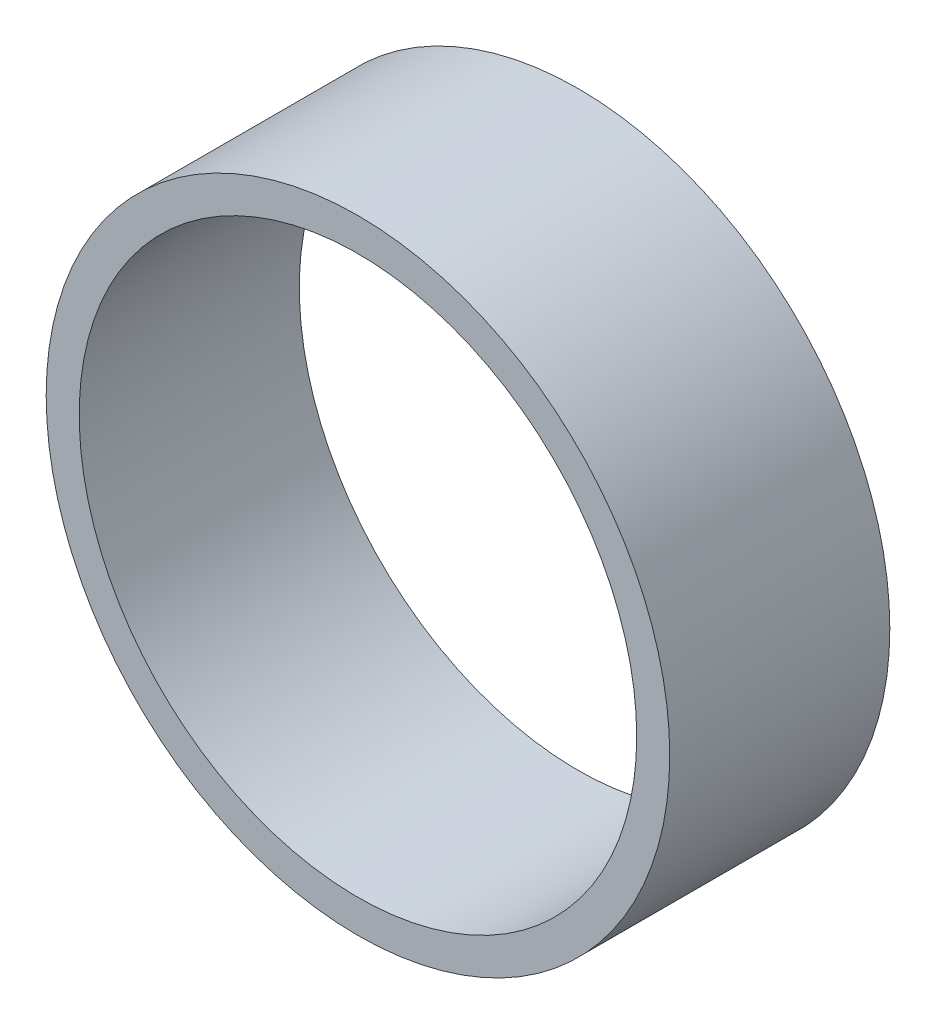
ISO-10303-21;
HEADER;
FILE_DESCRIPTION(('STEP AP214'),'2;1');
FILE_NAME('part.step','',(''),(''),'','','');
FILE_SCHEMA(('AUTOMOTIVE_DESIGN { 1 0 10303 214 1 1 1 1 }'));
ENDSEC;
DATA;
#1=APPLICATION_CONTEXT('core data for automotive mechanical design processes');
#2=APPLICATION_PROTOCOL_DEFINITION('international standard','automotive_design',2000,#1);
#3=PRODUCT_CONTEXT('',#1,'mechanical');
#4=PRODUCT('Part','Part','',(#3));
#5=PRODUCT_RELATED_PRODUCT_CATEGORY('part','',(#4));
#6=PRODUCT_DEFINITION_FORMATION('','',#4);
#7=PRODUCT_DEFINITION_CONTEXT('part definition',#1,'design');
#8=PRODUCT_DEFINITION('design','',#6,#7);
#9=PRODUCT_DEFINITION_SHAPE('','',#8);
#10=(LENGTH_UNIT() NAMED_UNIT(*) SI_UNIT(.MILLI.,.METRE.));
#11=(NAMED_UNIT(*) PLANE_ANGLE_UNIT() SI_UNIT($,.RADIAN.));
#12=(NAMED_UNIT(*) SI_UNIT($,.STERADIAN.) SOLID_ANGLE_UNIT());
#13=UNCERTAINTY_MEASURE_WITH_UNIT(LENGTH_MEASURE(1.E-05),#10,'distance_accuracy_value','');
#14=(GEOMETRIC_REPRESENTATION_CONTEXT(3) GLOBAL_UNCERTAINTY_ASSIGNED_CONTEXT((#13)) GLOBAL_UNIT_ASSIGNED_CONTEXT((#10,
#11,#12)) REPRESENTATION_CONTEXT('',''));
#15=CARTESIAN_POINT('',(0.,0.,0.));
#16=DIRECTION('',(0.,0.,1.));
#17=DIRECTION('',(1.,0.,0.));
#18=AXIS2_PLACEMENT_3D('',#15,#16,#17);
#19=CARTESIAN_POINT('',(0.,0.,38.1));
#20=DIRECTION('',(0.,0.,-1.));
#21=DIRECTION('',(-1.,0.,0.));
#22=AXIS2_PLACEMENT_3D('',#19,#20,#21);
#23=CYLINDRICAL_SURFACE('',#22,53.975);
#24=CARTESIAN_POINT('',(0.,0.,38.1));
#25=DIRECTION('',(0.,0.,1.));
#26=DIRECTION('',(1.,0.,0.));
#27=AXIS2_PLACEMENT_3D('',#24,#25,#26);
#28=CIRCLE('',#27,53.975);
#29=CARTESIAN_POINT('',(-53.975,0.,38.1));
#30=VERTEX_POINT('',#29);
#31=EDGE_CURVE('E10',#30,#30,#28,.T.);
#32=CARTESIAN_POINT('',(0.,0.,0.));
#33=DIRECTION('',(0.,0.,1.));
#34=DIRECTION('',(1.,0.,0.));
#35=AXIS2_PLACEMENT_3D('',#32,#33,#34);
#36=CIRCLE('',#35,53.975);
#37=CARTESIAN_POINT('',(-53.975,0.,0.));
#38=VERTEX_POINT('',#37);
#39=EDGE_CURVE('E44',#38,#38,#36,.T.);
#40=CARTESIAN_POINT('',(-53.975,0.,38.1));
#41=CARTESIAN_POINT('',(-53.975,0.,37.703125));
#42=CARTESIAN_POINT('',(-53.975,0.,37.30625));
#43=CARTESIAN_POINT('',(-53.975,0.,36.5125));
#44=CARTESIAN_POINT('',(-53.975,0.,36.115625));
#45=CARTESIAN_POINT('',(-53.975,0.,35.321875));
#46=CARTESIAN_POINT('',(-53.975,0.,34.925));
#47=CARTESIAN_POINT('',(-53.975,0.,34.13125));
#48=CARTESIAN_POINT('',(-53.975,0.,33.734375));
#49=CARTESIAN_POINT('',(-53.975,0.,32.940625));
#50=CARTESIAN_POINT('',(-53.975,0.,32.54375));
#51=CARTESIAN_POINT('',(-53.975,0.,31.75));
#52=CARTESIAN_POINT('',(-53.975,0.,31.353125));
#53=CARTESIAN_POINT('',(-53.975,0.,30.559375));
#54=CARTESIAN_POINT('',(-53.975,0.,30.1625));
#55=CARTESIAN_POINT('',(-53.975,0.,29.36875));
#56=CARTESIAN_POINT('',(-53.975,0.,28.971875));
#57=CARTESIAN_POINT('',(-53.975,0.,28.178125));
#58=CARTESIAN_POINT('',(-53.975,0.,27.78125));
#59=CARTESIAN_POINT('',(-53.975,0.,26.9875));
#60=CARTESIAN_POINT('',(-53.975,0.,26.590625));
#61=CARTESIAN_POINT('',(-53.975,0.,25.796875));
#62=CARTESIAN_POINT('',(-53.975,0.,25.4));
#63=CARTESIAN_POINT('',(-53.975,0.,24.60625));
#64=CARTESIAN_POINT('',(-53.975,0.,24.209375));
#65=CARTESIAN_POINT('',(-53.975,0.,23.415625));
#66=CARTESIAN_POINT('',(-53.975,0.,23.01875));
#67=CARTESIAN_POINT('',(-53.975,0.,22.225));
#68=CARTESIAN_POINT('',(-53.975,0.,21.828125));
#69=CARTESIAN_POINT('',(-53.975,0.,21.034375));
#70=CARTESIAN_POINT('',(-53.975,0.,20.6375));
#71=CARTESIAN_POINT('',(-53.975,0.,19.84375));
#72=CARTESIAN_POINT('',(-53.975,0.,19.446875));
#73=CARTESIAN_POINT('',(-53.975,0.,18.653125));
#74=CARTESIAN_POINT('',(-53.975,0.,18.25625));
#75=CARTESIAN_POINT('',(-53.975,0.,17.4625));
#76=CARTESIAN_POINT('',(-53.975,0.,17.065625));
#77=CARTESIAN_POINT('',(-53.975,0.,16.271875));
#78=CARTESIAN_POINT('',(-53.975,0.,15.875));
#79=CARTESIAN_POINT('',(-53.975,0.,15.08125));
#80=CARTESIAN_POINT('',(-53.975,0.,14.684375));
#81=CARTESIAN_POINT('',(-53.975,0.,13.890625));
#82=CARTESIAN_POINT('',(-53.975,0.,13.49375));
#83=CARTESIAN_POINT('',(-53.975,0.,12.7));
#84=CARTESIAN_POINT('',(-53.975,0.,12.303125));
#85=CARTESIAN_POINT('',(-53.975,0.,11.509375));
#86=CARTESIAN_POINT('',(-53.975,0.,11.1125));
#87=CARTESIAN_POINT('',(-53.975,0.,10.31875));
#88=CARTESIAN_POINT('',(-53.975,0.,9.92187499999999));
#89=CARTESIAN_POINT('',(-53.975,0.,9.128125));
#90=CARTESIAN_POINT('',(-53.975,0.,8.73124999999999));
#91=CARTESIAN_POINT('',(-53.975,0.,7.93749999999999));
#92=CARTESIAN_POINT('',(-53.975,0.,7.54062499999999));
#93=CARTESIAN_POINT('',(-53.975,0.,6.746875));
#94=CARTESIAN_POINT('',(-53.975,0.,6.35));
#95=CARTESIAN_POINT('',(-53.975,0.,5.55625));
#96=CARTESIAN_POINT('',(-53.975,0.,5.159375));
#97=CARTESIAN_POINT('',(-53.975,0.,4.365625));
#98=CARTESIAN_POINT('',(-53.975,0.,3.96875));
#99=CARTESIAN_POINT('',(-53.975,0.,3.175));
#100=CARTESIAN_POINT('',(-53.975,0.,2.778125));
#101=CARTESIAN_POINT('',(-53.975,0.,1.984375));
#102=CARTESIAN_POINT('',(-53.975,0.,1.5875));
#103=CARTESIAN_POINT('',(-53.975,0.,0.79375));
#104=CARTESIAN_POINT('',(-53.975,0.,0.396875));
#105=CARTESIAN_POINT('',(-53.975,0.,0.));
#106=B_SPLINE_CURVE_WITH_KNOTS('',3,(#40,#41,#42,#43,#44,#45,#46,#47,#48,#49,#50,#51,#52,#53,
#54,#55,#56,#57,#58,#59,#60,#61,#62,#63,#64,#65,#66,#67,#68,#69,#70,#71,#72,#73,#74,#75,#76,#77,
#78,#79,#80,#81,#82,#83,#84,#85,#86,#87,#88,#89,#90,#91,#92,#93,#94,#95,#96,#97,#98,#99,#100,
#101,#102,#103,#104,#105),.UNSPECIFIED.,.F.,.F.,(4,2,2,2,2,2,2,2,2,2,2,2,2,2,2,2,2,2,2,2,2,2,2,
2,2,2,2,2,2,2,2,2,4),(0.,1.190625,2.38125,3.571875,4.7625,5.953125,7.14375,8.334375,
9.52500000000001,10.715625,11.90625,13.096875,14.2875,15.478125,16.66875,17.859375,19.05,
20.240625,21.43125,22.621875,23.8125,25.003125,26.19375,27.384375,28.575,29.765625,30.95625,
32.146875,33.3375,34.528125,35.71875,36.909375,38.1),.UNSPECIFIED.);
#107=EDGE_CURVE('BSEAM41',#30,#38,#106,.T.);
#108=ORIENTED_EDGE('',*,*,#31,.F.);
#109=ORIENTED_EDGE('',*,*,#39,.T.);
#110=ORIENTED_EDGE('',*,*,#107,.T.);
#111=ORIENTED_EDGE('',*,*,#107,.F.);
#112=EDGE_LOOP('',(#108,#110,#109,#111));
#113=FACE_BOUND('',#112,.T.);
#114=ADVANCED_FACE('F41',(#113),#23,.T.);
#115=CARTESIAN_POINT('',(0.,0.,38.1));
#116=DIRECTION('',(0.,0.,1.));
#117=DIRECTION('',(1.,0.,0.));
#118=AXIS2_PLACEMENT_3D('',#115,#116,#117);
#119=PLANE('',#118);
#120=CARTESIAN_POINT('',(0.,0.,38.1));
#121=DIRECTION('',(0.,0.,1.));
#122=DIRECTION('',(1.,0.,0.));
#123=AXIS2_PLACEMENT_3D('',#120,#121,#122);
#124=CIRCLE('',#123,48.26);
#125=CARTESIAN_POINT('',(48.26,0.,38.1));
#126=VERTEX_POINT('',#125);
#127=EDGE_CURVE('E55',#126,#126,#124,.T.);
#128=ORIENTED_EDGE('',*,*,#127,.F.);
#129=EDGE_LOOP('',(#128));
#130=FACE_BOUND('',#129,.T.);
#131=ORIENTED_EDGE('',*,*,#31,.T.);
#132=EDGE_LOOP('',(#131));
#133=FACE_BOUND('',#132,.T.);
#134=ADVANCED_FACE('F72',(#130,#133),#119,.T.);
#135=CARTESIAN_POINT('',(0.,0.,0.));
#136=DIRECTION('',(0.,0.,1.));
#137=DIRECTION('',(1.,0.,0.));
#138=AXIS2_PLACEMENT_3D('',#135,#136,#137);
#139=PLANE('',#138);
#140=CARTESIAN_POINT('',(0.,0.,0.));
#141=DIRECTION('',(0.,0.,1.));
#142=DIRECTION('',(1.,0.,0.));
#143=AXIS2_PLACEMENT_3D('',#140,#141,#142);
#144=CIRCLE('',#143,48.26);
#145=CARTESIAN_POINT('',(48.26,0.,0.));
#146=VERTEX_POINT('',#145);
#147=EDGE_CURVE('E53',#146,#146,#144,.T.);
#148=ORIENTED_EDGE('',*,*,#147,.T.);
#149=EDGE_LOOP('',(#148));
#150=FACE_BOUND('',#149,.T.);
#151=ORIENTED_EDGE('',*,*,#39,.F.);
#152=EDGE_LOOP('',(#151));
#153=FACE_BOUND('',#152,.T.);
#154=ADVANCED_FACE('F63',(#150,#153),#139,.F.);
#155=CARTESIAN_POINT('',(0.,0.,0.));
#156=DIRECTION('',(0.,0.,1.));
#157=DIRECTION('',(1.,0.,0.));
#158=AXIS2_PLACEMENT_3D('',#155,#156,#157);
#159=CYLINDRICAL_SURFACE('',#158,48.26);
#160=CARTESIAN_POINT('',(48.26,0.,0.));
#161=CARTESIAN_POINT('',(48.26,0.,0.396875));
#162=CARTESIAN_POINT('',(48.26,0.,0.79375));
#163=CARTESIAN_POINT('',(48.26,0.,1.5875));
#164=CARTESIAN_POINT('',(48.26,0.,1.984375));
#165=CARTESIAN_POINT('',(48.26,0.,2.778125));
#166=CARTESIAN_POINT('',(48.26,0.,3.175));
#167=CARTESIAN_POINT('',(48.26,0.,3.96875));
#168=CARTESIAN_POINT('',(48.26,0.,4.365625));
#169=CARTESIAN_POINT('',(48.26,0.,5.159375));
#170=CARTESIAN_POINT('',(48.26,0.,5.55625));
#171=CARTESIAN_POINT('',(48.26,0.,6.35));
#172=CARTESIAN_POINT('',(48.26,0.,6.746875));
#173=CARTESIAN_POINT('',(48.26,0.,7.540625));
#174=CARTESIAN_POINT('',(48.26,0.,7.9375));
#175=CARTESIAN_POINT('',(48.26,0.,8.73125));
#176=CARTESIAN_POINT('',(48.26,0.,9.128125));
#177=CARTESIAN_POINT('',(48.26,0.,9.921875));
#178=CARTESIAN_POINT('',(48.26,0.,10.31875));
#179=CARTESIAN_POINT('',(48.26,0.,11.1125));
#180=CARTESIAN_POINT('',(48.26,0.,11.509375));
#181=CARTESIAN_POINT('',(48.26,0.,12.303125));
#182=CARTESIAN_POINT('',(48.26,0.,12.7));
#183=CARTESIAN_POINT('',(48.26,0.,13.49375));
#184=CARTESIAN_POINT('',(48.26,0.,13.890625));
#185=CARTESIAN_POINT('',(48.26,0.,14.684375));
#186=CARTESIAN_POINT('',(48.26,0.,15.08125));
#187=CARTESIAN_POINT('',(48.26,0.,15.875));
#188=CARTESIAN_POINT('',(48.26,0.,16.271875));
#189=CARTESIAN_POINT('',(48.26,0.,17.065625));
#190=CARTESIAN_POINT('',(48.26,0.,17.4625));
#191=CARTESIAN_POINT('',(48.26,0.,18.25625));
#192=CARTESIAN_POINT('',(48.26,0.,18.653125));
#193=CARTESIAN_POINT('',(48.26,0.,19.446875));
#194=CARTESIAN_POINT('',(48.26,0.,19.84375));
#195=CARTESIAN_POINT('',(48.26,0.,20.6375));
#196=CARTESIAN_POINT('',(48.26,0.,21.034375));
#197=CARTESIAN_POINT('',(48.26,0.,21.828125));
#198=CARTESIAN_POINT('',(48.26,0.,22.225));
#199=CARTESIAN_POINT('',(48.26,0.,23.01875));
#200=CARTESIAN_POINT('',(48.26,0.,23.415625));
#201=CARTESIAN_POINT('',(48.26,0.,24.209375));
#202=CARTESIAN_POINT('',(48.26,0.,24.60625));
#203=CARTESIAN_POINT('',(48.26,0.,25.4));
#204=CARTESIAN_POINT('',(48.26,0.,25.796875));
#205=CARTESIAN_POINT('',(48.26,0.,26.590625));
#206=CARTESIAN_POINT('',(48.26,0.,26.9875));
#207=CARTESIAN_POINT('',(48.26,0.,27.78125));
#208=CARTESIAN_POINT('',(48.26,0.,28.178125));
#209=CARTESIAN_POINT('',(48.26,0.,28.971875));
#210=CARTESIAN_POINT('',(48.26,0.,29.36875));
#211=CARTESIAN_POINT('',(48.26,0.,30.1625));
#212=CARTESIAN_POINT('',(48.26,0.,30.559375));
#213=CARTESIAN_POINT('',(48.26,0.,31.353125));
#214=CARTESIAN_POINT('',(48.26,0.,31.75));
#215=CARTESIAN_POINT('',(48.26,0.,32.54375));
#216=CARTESIAN_POINT('',(48.26,0.,32.940625));
#217=CARTESIAN_POINT('',(48.26,0.,33.734375));
#218=CARTESIAN_POINT('',(48.26,0.,34.13125));
#219=CARTESIAN_POINT('',(48.26,0.,34.925));
#220=CARTESIAN_POINT('',(48.26,0.,35.321875));
#221=CARTESIAN_POINT('',(48.26,0.,36.115625));
#222=CARTESIAN_POINT('',(48.26,0.,36.5125));
#223=CARTESIAN_POINT('',(48.26,0.,37.30625));
#224=CARTESIAN_POINT('',(48.26,0.,37.703125));
#225=CARTESIAN_POINT('',(48.26,0.,38.1));
#226=B_SPLINE_CURVE_WITH_KNOTS('',3,(#160,#161,#162,#163,#164,#165,#166,#167,#168,#169,#170,
#171,#172,#173,#174,#175,#176,#177,#178,#179,#180,#181,#182,#183,#184,#185,#186,#187,#188,#189,
#190,#191,#192,#193,#194,#195,#196,#197,#198,#199,#200,#201,#202,#203,#204,#205,#206,#207,#208,
#209,#210,#211,#212,#213,#214,#215,#216,#217,#218,#219,#220,#221,#222,#223,#224,#225),
.UNSPECIFIED.,.F.,.F.,(4,2,2,2,2,2,2,2,2,2,2,2,2,2,2,2,2,2,2,2,2,2,2,2,2,2,2,2,2,2,2,2,4),(0.,
1.190625,2.38125,3.571875,4.7625,5.953125,7.14375,8.334375,9.525,10.715625,11.90625,13.096875,
14.2875,15.478125,16.66875,17.859375,19.05,20.240625,21.43125,22.621875,23.8125,25.003125,
26.19375,27.384375,28.575,29.765625,30.95625,32.146875,33.3375,34.528125,35.71875,36.909375,
38.1),.UNSPECIFIED.);
#227=EDGE_CURVE('BSEAM66',#146,#126,#226,.T.);
#228=ORIENTED_EDGE('',*,*,#147,.F.);
#229=ORIENTED_EDGE('',*,*,#127,.T.);
#230=ORIENTED_EDGE('',*,*,#227,.T.);
#231=ORIENTED_EDGE('',*,*,#227,.F.);
#232=EDGE_LOOP('',(#228,#230,#229,#231));
#233=FACE_BOUND('',#232,.T.);
#234=ADVANCED_FACE('F66',(#233),#159,.F.);
#235=CLOSED_SHELL('',(#114,#134,#154,#234));
#236=MANIFOLD_SOLID_BREP('B2',#235);
#237=ADVANCED_BREP_SHAPE_REPRESENTATION('',(#18,#236),#14);
#238=SHAPE_DEFINITION_REPRESENTATION(#9,#237);
ENDSEC;
END-ISO-10303-21;
